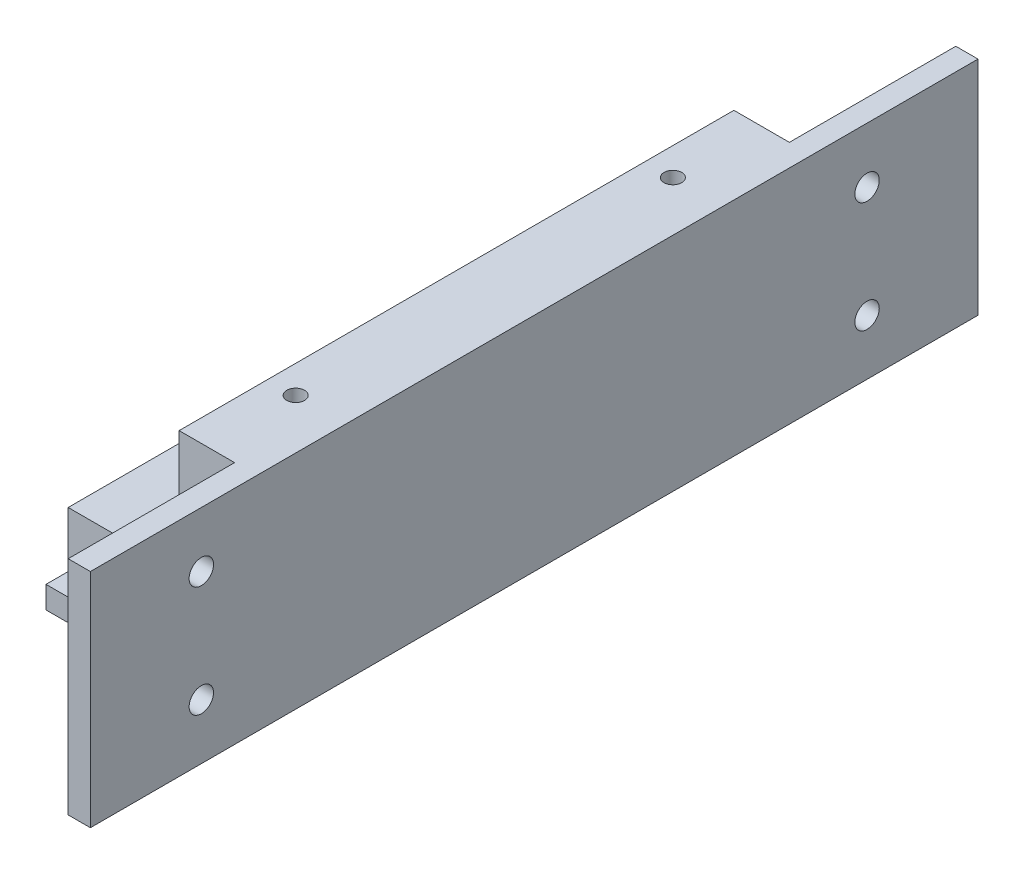
ISO-10303-21;
HEADER;
FILE_DESCRIPTION(('STEP AP214'),'2;1');
FILE_NAME('part.step','',(''),(''),'','','');
FILE_SCHEMA(('AUTOMOTIVE_DESIGN { 1 0 10303 214 1 1 1 1 }'));
ENDSEC;
DATA;
#1=APPLICATION_CONTEXT('core data for automotive mechanical design processes');
#2=APPLICATION_PROTOCOL_DEFINITION('international standard','automotive_design',2000,#1);
#3=PRODUCT_CONTEXT('',#1,'mechanical');
#4=PRODUCT('Part','Part','',(#3));
#5=PRODUCT_RELATED_PRODUCT_CATEGORY('part','',(#4));
#6=PRODUCT_DEFINITION_FORMATION('','',#4);
#7=PRODUCT_DEFINITION_CONTEXT('part definition',#1,'design');
#8=PRODUCT_DEFINITION('design','',#6,#7);
#9=PRODUCT_DEFINITION_SHAPE('','',#8);
#10=(LENGTH_UNIT() NAMED_UNIT(*) SI_UNIT(.MILLI.,.METRE.));
#11=(NAMED_UNIT(*) PLANE_ANGLE_UNIT() SI_UNIT($,.RADIAN.));
#12=(NAMED_UNIT(*) SI_UNIT($,.STERADIAN.) SOLID_ANGLE_UNIT());
#13=UNCERTAINTY_MEASURE_WITH_UNIT(LENGTH_MEASURE(1.E-05),#10,'distance_accuracy_value','');
#14=(GEOMETRIC_REPRESENTATION_CONTEXT(3) GLOBAL_UNCERTAINTY_ASSIGNED_CONTEXT((#13)) GLOBAL_UNIT_ASSIGNED_CONTEXT((#10,
#11,#12)) REPRESENTATION_CONTEXT('',''));
#15=CARTESIAN_POINT('',(0.,0.,0.));
#16=DIRECTION('',(0.,0.,1.));
#17=DIRECTION('',(1.,0.,0.));
#18=AXIS2_PLACEMENT_3D('',#15,#16,#17);
#19=CARTESIAN_POINT('',(-1.,2.,-25.));
#20=DIRECTION('',(0.,0.,1.));
#21=DIRECTION('',(1.,0.,0.));
#22=AXIS2_PLACEMENT_3D('',#19,#20,#21);
#23=PLANE('',#22);
#24=DIRECTION('',(-1.,0.,0.));
#25=VECTOR('',#24,1.);
#26=CARTESIAN_POINT('',(21.,20.,-25.));
#27=LINE('',#26,#25);
#28=CARTESIAN_POINT('',(16.,20.,-25.));
#29=VERTEX_POINT('',#28);
#30=CARTESIAN_POINT('',(11.,20.,-25.));
#31=VERTEX_POINT('',#30);
#32=EDGE_CURVE('E182',#29,#31,#27,.T.);
#33=ORIENTED_EDGE('',*,*,#32,.F.);
#34=DIRECTION('',(0.,-1.,0.));
#35=VECTOR('',#34,1.);
#36=CARTESIAN_POINT('',(16.,0.,-25.));
#37=LINE('',#36,#35);
#38=CARTESIAN_POINT('',(16.,0.,-25.));
#39=VERTEX_POINT('',#38);
#40=EDGE_CURVE('E215',#29,#39,#37,.T.);
#41=ORIENTED_EDGE('',*,*,#40,.T.);
#42=DIRECTION('',(-1.,0.,0.));
#43=VECTOR('',#42,1.);
#44=CARTESIAN_POINT('',(-1.,0.,-25.));
#45=LINE('',#44,#43);
#46=CARTESIAN_POINT('',(-1.,0.,-25.));
#47=VERTEX_POINT('',#46);
#48=EDGE_CURVE('E184',#39,#47,#45,.T.);
#49=ORIENTED_EDGE('',*,*,#48,.T.);
#50=DIRECTION('',(0.,-1.,0.));
#51=VECTOR('',#50,1.);
#52=CARTESIAN_POINT('',(-1.,2.,-25.));
#53=LINE('',#52,#51);
#54=CARTESIAN_POINT('',(-1.,2.,-25.));
#55=VERTEX_POINT('',#54);
#56=EDGE_CURVE('E11',#55,#47,#53,.T.);
#57=ORIENTED_EDGE('',*,*,#56,.F.);
#58=DIRECTION('',(-1.,0.,0.));
#59=VECTOR('',#58,1.);
#60=CARTESIAN_POINT('',(-1.,2.,-25.));
#61=LINE('',#60,#59);
#62=CARTESIAN_POINT('',(1.,2.,-25.));
#63=VERTEX_POINT('',#62);
#64=EDGE_CURVE('E188',#63,#55,#61,.T.);
#65=ORIENTED_EDGE('',*,*,#64,.F.);
#66=DIRECTION('',(0.,1.,0.));
#67=VECTOR('',#66,1.);
#68=CARTESIAN_POINT('',(1.,0.,-25.));
#69=LINE('',#68,#67);
#70=CARTESIAN_POINT('',(1.,9.,-25.));
#71=VERTEX_POINT('',#70);
#72=EDGE_CURVE('E177',#63,#71,#69,.T.);
#73=ORIENTED_EDGE('',*,*,#72,.T.);
#74=DIRECTION('',(1.,0.,0.));
#75=VECTOR('',#74,1.);
#76=CARTESIAN_POINT('',(1.,9.,-25.));
#77=LINE('',#76,#75);
#78=CARTESIAN_POINT('',(11.,9.,-25.));
#79=VERTEX_POINT('',#78);
#80=EDGE_CURVE('E157',#71,#79,#77,.T.);
#81=ORIENTED_EDGE('',*,*,#80,.T.);
#82=DIRECTION('',(0.,1.,0.));
#83=VECTOR('',#82,1.);
#84=CARTESIAN_POINT('',(11.,20.,-25.));
#85=LINE('',#84,#83);
#86=EDGE_CURVE('E160',#79,#31,#85,.T.);
#87=ORIENTED_EDGE('',*,*,#86,.T.);
#88=EDGE_LOOP('',(#33,#41,#49,#57,#65,#73,#81,#87));
#89=FACE_BOUND('',#88,.T.);
#90=ADVANCED_FACE('F39',(#89),#23,.F.);
#91=CARTESIAN_POINT('',(-1.,2.,25.));
#92=DIRECTION('',(1.,0.,0.));
#93=DIRECTION('',(0.,0.,-1.));
#94=AXIS2_PLACEMENT_3D('',#91,#92,#93);
#95=PLANE('',#94);
#96=DIRECTION('',(0.,0.,1.));
#97=VECTOR('',#96,1.);
#98=CARTESIAN_POINT('',(-1.,0.,25.));
#99=LINE('',#98,#97);
#100=CARTESIAN_POINT('',(-1.,0.,25.));
#101=VERTEX_POINT('',#100);
#102=EDGE_CURVE('E197',#47,#101,#99,.T.);
#103=ORIENTED_EDGE('',*,*,#102,.T.);
#104=DIRECTION('',(0.,-1.,0.));
#105=VECTOR('',#104,1.);
#106=CARTESIAN_POINT('',(-1.,2.,25.));
#107=LINE('',#106,#105);
#108=CARTESIAN_POINT('',(-1.,2.,25.));
#109=VERTEX_POINT('',#108);
#110=EDGE_CURVE('E46',#109,#101,#107,.T.);
#111=ORIENTED_EDGE('',*,*,#110,.F.);
#112=DIRECTION('',(0.,0.,1.));
#113=VECTOR('',#112,1.);
#114=CARTESIAN_POINT('',(-1.,2.,25.));
#115=LINE('',#114,#113);
#116=EDGE_CURVE('E191',#55,#109,#115,.T.);
#117=ORIENTED_EDGE('',*,*,#116,.F.);
#118=ORIENTED_EDGE('',*,*,#56,.T.);
#119=EDGE_LOOP('',(#103,#111,#117,#118));
#120=FACE_BOUND('',#119,.T.);
#121=ADVANCED_FACE('F304',(#120),#95,.F.);
#122=CARTESIAN_POINT('',(-1.,2.,25.));
#123=DIRECTION('',(0.,0.,-1.));
#124=DIRECTION('',(-1.,0.,0.));
#125=AXIS2_PLACEMENT_3D('',#122,#123,#124);
#126=PLANE('',#125);
#127=DIRECTION('',(1.,0.,0.));
#128=VECTOR('',#127,1.);
#129=CARTESIAN_POINT('',(-1.,0.,25.));
#130=LINE('',#129,#128);
#131=CARTESIAN_POINT('',(16.,0.,25.));
#132=VERTEX_POINT('',#131);
#133=EDGE_CURVE('E189',#101,#132,#130,.T.);
#134=ORIENTED_EDGE('',*,*,#133,.T.);
#135=DIRECTION('',(0.,1.,0.));
#136=VECTOR('',#135,1.);
#137=CARTESIAN_POINT('',(16.,20.,25.));
#138=LINE('',#137,#136);
#139=CARTESIAN_POINT('',(16.,20.,25.));
#140=VERTEX_POINT('',#139);
#141=EDGE_CURVE('E154',#132,#140,#138,.T.);
#142=ORIENTED_EDGE('',*,*,#141,.T.);
#143=DIRECTION('',(-1.,0.,0.));
#144=VECTOR('',#143,1.);
#145=CARTESIAN_POINT('',(21.,20.,25.));
#146=LINE('',#145,#144);
#147=CARTESIAN_POINT('',(11.,20.,25.));
#148=VERTEX_POINT('',#147);
#149=EDGE_CURVE('E180',#140,#148,#146,.T.);
#150=ORIENTED_EDGE('',*,*,#149,.T.);
#151=DIRECTION('',(0.,1.,0.));
#152=VECTOR('',#151,1.);
#153=CARTESIAN_POINT('',(11.,20.,25.));
#154=LINE('',#153,#152);
#155=CARTESIAN_POINT('',(11.,9.,25.));
#156=VERTEX_POINT('',#155);
#157=EDGE_CURVE('E161',#156,#148,#154,.T.);
#158=ORIENTED_EDGE('',*,*,#157,.F.);
#159=DIRECTION('',(1.,0.,0.));
#160=VECTOR('',#159,1.);
#161=CARTESIAN_POINT('',(1.,9.,25.));
#162=LINE('',#161,#160);
#163=CARTESIAN_POINT('',(1.,9.,25.));
#164=VERTEX_POINT('',#163);
#165=EDGE_CURVE('E151',#164,#156,#162,.T.);
#166=ORIENTED_EDGE('',*,*,#165,.F.);
#167=DIRECTION('',(0.,-1.,0.));
#168=VECTOR('',#167,1.);
#169=CARTESIAN_POINT('',(1.,0.,25.));
#170=LINE('',#169,#168);
#171=CARTESIAN_POINT('',(1.,2.,25.));
#172=VERTEX_POINT('',#171);
#173=EDGE_CURVE('E172',#164,#172,#170,.T.);
#174=ORIENTED_EDGE('',*,*,#173,.T.);
#175=DIRECTION('',(1.,0.,0.));
#176=VECTOR('',#175,1.);
#177=CARTESIAN_POINT('',(-1.,2.,25.));
#178=LINE('',#177,#176);
#179=EDGE_CURVE('E193',#109,#172,#178,.T.);
#180=ORIENTED_EDGE('',*,*,#179,.F.);
#181=ORIENTED_EDGE('',*,*,#110,.T.);
#182=EDGE_LOOP('',(#134,#142,#150,#158,#166,#174,#180,#181));
#183=FACE_BOUND('',#182,.T.);
#184=ADVANCED_FACE('F205',(#183),#126,.F.);
#185=CARTESIAN_POINT('',(0.,2.,0.));
#186=DIRECTION('',(0.,-1.,0.));
#187=DIRECTION('',(0.,0.,-1.));
#188=AXIS2_PLACEMENT_3D('',#185,#186,#187);
#189=PLANE('',#188);
#190=DIRECTION('',(0.,0.,-1.));
#191=VECTOR('',#190,1.);
#192=CARTESIAN_POINT('',(1.,2.,25.));
#193=LINE('',#192,#191);
#194=EDGE_CURVE('E185',#172,#63,#193,.T.);
#195=ORIENTED_EDGE('',*,*,#194,.T.);
#196=ORIENTED_EDGE('',*,*,#64,.T.);
#197=ORIENTED_EDGE('',*,*,#116,.T.);
#198=ORIENTED_EDGE('',*,*,#179,.T.);
#199=EDGE_LOOP('',(#195,#196,#197,#198));
#200=FACE_BOUND('',#199,.T.);
#201=ADVANCED_FACE('F302',(#200),#189,.F.);
#202=CARTESIAN_POINT('',(0.,0.,0.));
#203=DIRECTION('',(0.,-1.,0.));
#204=DIRECTION('',(0.,0.,-1.));
#205=AXIS2_PLACEMENT_3D('',#202,#203,#204);
#206=PLANE('',#205);
#207=DIRECTION('',(0.,0.,1.));
#208=VECTOR('',#207,1.);
#209=CARTESIAN_POINT('',(18.,0.,40.));
#210=LINE('',#209,#208);
#211=CARTESIAN_POINT('',(18.,0.,-40.));
#212=VERTEX_POINT('',#211);
#213=CARTESIAN_POINT('',(18.,0.,40.));
#214=VERTEX_POINT('',#213);
#215=EDGE_CURVE('E53',#212,#214,#210,.T.);
#216=ORIENTED_EDGE('',*,*,#215,.T.);
#217=DIRECTION('',(1.,0.,0.));
#218=VECTOR('',#217,1.);
#219=CARTESIAN_POINT('',(16.,0.,40.));
#220=LINE('',#219,#218);
#221=CARTESIAN_POINT('',(16.,0.,40.));
#222=VERTEX_POINT('',#221);
#223=EDGE_CURVE('E140',#222,#214,#220,.T.);
#224=ORIENTED_EDGE('',*,*,#223,.F.);
#225=DIRECTION('',(0.,0.,-1.));
#226=VECTOR('',#225,1.);
#227=CARTESIAN_POINT('',(16.,0.,40.));
#228=LINE('',#227,#226);
#229=EDGE_CURVE('E211',#222,#132,#228,.T.);
#230=ORIENTED_EDGE('',*,*,#229,.T.);
#231=ORIENTED_EDGE('',*,*,#133,.F.);
#232=ORIENTED_EDGE('',*,*,#102,.F.);
#233=ORIENTED_EDGE('',*,*,#48,.F.);
#234=DIRECTION('',(0.,0.,-1.));
#235=VECTOR('',#234,1.);
#236=CARTESIAN_POINT('',(16.,0.,-25.));
#237=LINE('',#236,#235);
#238=CARTESIAN_POINT('',(16.,0.,-40.));
#239=VERTEX_POINT('',#238);
#240=EDGE_CURVE('E61',#39,#239,#237,.T.);
#241=ORIENTED_EDGE('',*,*,#240,.T.);
#242=DIRECTION('',(1.,0.,0.));
#243=VECTOR('',#242,1.);
#244=CARTESIAN_POINT('',(16.,0.,-40.));
#245=LINE('',#244,#243);
#246=EDGE_CURVE('E142',#239,#212,#245,.T.);
#247=ORIENTED_EDGE('',*,*,#246,.T.);
#248=EDGE_LOOP('',(#216,#224,#230,#231,#232,#233,#241,#247));
#249=FACE_BOUND('',#248,.T.);
#250=ADVANCED_FACE('F138',(#249),#206,.T.);
#251=CARTESIAN_POINT('',(1.,0.,0.));
#252=DIRECTION('',(-1.,0.,0.));
#253=DIRECTION('',(0.,0.,1.));
#254=AXIS2_PLACEMENT_3D('',#251,#252,#253);
#255=PLANE('',#254);
#256=DIRECTION('',(0.,0.,1.));
#257=VECTOR('',#256,1.);
#258=CARTESIAN_POINT('',(1.,9.,-25.));
#259=LINE('',#258,#257);
#260=EDGE_CURVE('E164',#71,#164,#259,.T.);
#261=ORIENTED_EDGE('',*,*,#260,.F.);
#262=ORIENTED_EDGE('',*,*,#72,.F.);
#263=ORIENTED_EDGE('',*,*,#194,.F.);
#264=ORIENTED_EDGE('',*,*,#173,.F.);
#265=EDGE_LOOP('',(#261,#262,#263,#264));
#266=FACE_BOUND('',#265,.T.);
#267=ADVANCED_FACE('F281',(#266),#255,.T.);
#268=CARTESIAN_POINT('',(21.,20.,25.));
#269=DIRECTION('',(0.,-1.,0.));
#270=DIRECTION('',(0.,0.,-1.));
#271=AXIS2_PLACEMENT_3D('',#268,#269,#270);
#272=PLANE('',#271);
#273=CARTESIAN_POINT('',(13.5,20.,-17.));
#274=DIRECTION('',(0.,1.,0.));
#275=DIRECTION('',(0.,0.,1.));
#276=AXIS2_PLACEMENT_3D('',#273,#274,#275);
#277=CIRCLE('',#276,0.799999999999999);
#278=CARTESIAN_POINT('',(13.5,20.,-16.2));
#279=VERTEX_POINT('',#278);
#280=EDGE_CURVE('E262',#279,#279,#277,.T.);
#281=ORIENTED_EDGE('',*,*,#280,.F.);
#282=EDGE_LOOP('',(#281));
#283=FACE_BOUND('',#282,.T.);
#284=CARTESIAN_POINT('',(13.5,20.,17.));
#285=DIRECTION('',(0.,1.,0.));
#286=DIRECTION('',(0.,0.,1.));
#287=AXIS2_PLACEMENT_3D('',#284,#285,#286);
#288=CIRCLE('',#287,0.8);
#289=CARTESIAN_POINT('',(13.5,20.,17.8));
#290=VERTEX_POINT('',#289);
#291=EDGE_CURVE('E259',#290,#290,#288,.T.);
#292=ORIENTED_EDGE('',*,*,#291,.F.);
#293=EDGE_LOOP('',(#292));
#294=FACE_BOUND('',#293,.T.);
#295=DIRECTION('',(1.,0.,0.));
#296=VECTOR('',#295,1.);
#297=CARTESIAN_POINT('',(16.,20.,40.));
#298=LINE('',#297,#296);
#299=CARTESIAN_POINT('',(16.,20.,40.));
#300=VERTEX_POINT('',#299);
#301=CARTESIAN_POINT('',(18.,20.,40.));
#302=VERTEX_POINT('',#301);
#303=EDGE_CURVE('E148',#300,#302,#298,.T.);
#304=ORIENTED_EDGE('',*,*,#303,.T.);
#305=DIRECTION('',(0.,0.,1.));
#306=VECTOR('',#305,1.);
#307=CARTESIAN_POINT('',(18.,20.,40.));
#308=LINE('',#307,#306);
#309=CARTESIAN_POINT('',(18.,20.,-40.));
#310=VERTEX_POINT('',#309);
#311=EDGE_CURVE('E129',#310,#302,#308,.T.);
#312=ORIENTED_EDGE('',*,*,#311,.F.);
#313=DIRECTION('',(1.,0.,0.));
#314=VECTOR('',#313,1.);
#315=CARTESIAN_POINT('',(16.,20.,-40.));
#316=LINE('',#315,#314);
#317=CARTESIAN_POINT('',(16.,20.,-40.));
#318=VERTEX_POINT('',#317);
#319=EDGE_CURVE('E133',#318,#310,#316,.T.);
#320=ORIENTED_EDGE('',*,*,#319,.F.);
#321=DIRECTION('',(0.,0.,1.));
#322=VECTOR('',#321,1.);
#323=CARTESIAN_POINT('',(16.,20.,-25.));
#324=LINE('',#323,#322);
#325=EDGE_CURVE('E223',#318,#29,#324,.T.);
#326=ORIENTED_EDGE('',*,*,#325,.T.);
#327=ORIENTED_EDGE('',*,*,#32,.T.);
#328=DIRECTION('',(0.,0.,1.));
#329=VECTOR('',#328,1.);
#330=CARTESIAN_POINT('',(11.,20.,-25.));
#331=LINE('',#330,#329);
#332=EDGE_CURVE('E169',#31,#148,#331,.T.);
#333=ORIENTED_EDGE('',*,*,#332,.T.);
#334=ORIENTED_EDGE('',*,*,#149,.F.);
#335=DIRECTION('',(0.,0.,1.));
#336=VECTOR('',#335,1.);
#337=CARTESIAN_POINT('',(16.,20.,40.));
#338=LINE('',#337,#336);
#339=EDGE_CURVE('E149',#140,#300,#338,.T.);
#340=ORIENTED_EDGE('',*,*,#339,.T.);
#341=EDGE_LOOP('',(#304,#312,#320,#326,#327,#333,#334,#340));
#342=FACE_BOUND('',#341,.T.);
#343=ADVANCED_FACE('F277',(#283,#294,#342),#272,.F.);
#344=CARTESIAN_POINT('',(11.,20.,-25.));
#345=DIRECTION('',(1.,0.,0.));
#346=DIRECTION('',(0.,1.,0.));
#347=AXIS2_PLACEMENT_3D('',#344,#345,#346);
#348=PLANE('',#347);
#349=ORIENTED_EDGE('',*,*,#157,.T.);
#350=ORIENTED_EDGE('',*,*,#332,.F.);
#351=ORIENTED_EDGE('',*,*,#86,.F.);
#352=DIRECTION('',(0.,0.,1.));
#353=VECTOR('',#352,1.);
#354=CARTESIAN_POINT('',(11.,9.,-25.));
#355=LINE('',#354,#353);
#356=EDGE_CURVE('E173',#79,#156,#355,.T.);
#357=ORIENTED_EDGE('',*,*,#356,.T.);
#358=EDGE_LOOP('',(#349,#350,#351,#357));
#359=FACE_BOUND('',#358,.T.);
#360=ADVANCED_FACE('F280',(#359),#348,.F.);
#361=CARTESIAN_POINT('',(1.,9.,-25.));
#362=DIRECTION('',(0.,-1.,0.));
#363=DIRECTION('',(0.,0.,-1.));
#364=AXIS2_PLACEMENT_3D('',#361,#362,#363);
#365=PLANE('',#364);
#366=ORIENTED_EDGE('',*,*,#165,.T.);
#367=ORIENTED_EDGE('',*,*,#356,.F.);
#368=ORIENTED_EDGE('',*,*,#80,.F.);
#369=ORIENTED_EDGE('',*,*,#260,.T.);
#370=EDGE_LOOP('',(#366,#367,#368,#369));
#371=FACE_BOUND('',#370,.T.);
#372=ADVANCED_FACE('F296',(#371),#365,.F.);
#373=CARTESIAN_POINT('',(16.,20.,40.));
#374=DIRECTION('',(0.,0.,1.));
#375=DIRECTION('',(1.,0.,0.));
#376=AXIS2_PLACEMENT_3D('',#373,#374,#375);
#377=PLANE('',#376);
#378=DIRECTION('',(0.,1.,0.));
#379=VECTOR('',#378,1.);
#380=CARTESIAN_POINT('',(18.,0.,40.));
#381=LINE('',#380,#379);
#382=EDGE_CURVE('E126',#214,#302,#381,.T.);
#383=ORIENTED_EDGE('',*,*,#382,.T.);
#384=ORIENTED_EDGE('',*,*,#303,.F.);
#385=DIRECTION('',(0.,-1.,0.));
#386=VECTOR('',#385,1.);
#387=CARTESIAN_POINT('',(16.,20.,40.));
#388=LINE('',#387,#386);
#389=EDGE_CURVE('E147',#300,#222,#388,.T.);
#390=ORIENTED_EDGE('',*,*,#389,.T.);
#391=ORIENTED_EDGE('',*,*,#223,.T.);
#392=EDGE_LOOP('',(#383,#384,#390,#391));
#393=FACE_BOUND('',#392,.T.);
#394=ADVANCED_FACE('F145',(#393),#377,.T.);
#395=CARTESIAN_POINT('',(16.,0.,0.));
#396=DIRECTION('',(1.,0.,0.));
#397=DIRECTION('',(0.,0.,-1.));
#398=AXIS2_PLACEMENT_3D('',#395,#396,#397);
#399=PLANE('',#398);
#400=CARTESIAN_POINT('',(16.,15.,30.));
#401=DIRECTION('',(1.,0.,0.));
#402=DIRECTION('',(0.,0.,-1.));
#403=AXIS2_PLACEMENT_3D('',#400,#401,#402);
#404=CIRCLE('',#403,1.1);
#405=CARTESIAN_POINT('',(16.,15.,28.9));
#406=VERTEX_POINT('',#405);
#407=EDGE_CURVE('E234',#406,#406,#404,.T.);
#408=ORIENTED_EDGE('',*,*,#407,.T.);
#409=EDGE_LOOP('',(#408));
#410=FACE_BOUND('',#409,.T.);
#411=CARTESIAN_POINT('',(16.,5.,30.));
#412=DIRECTION('',(1.,0.,0.));
#413=DIRECTION('',(0.,0.,-1.));
#414=AXIS2_PLACEMENT_3D('',#411,#412,#413);
#415=CIRCLE('',#414,1.1);
#416=CARTESIAN_POINT('',(16.,5.,28.9));
#417=VERTEX_POINT('',#416);
#418=EDGE_CURVE('E237',#417,#417,#415,.T.);
#419=ORIENTED_EDGE('',*,*,#418,.T.);
#420=EDGE_LOOP('',(#419));
#421=FACE_BOUND('',#420,.T.);
#422=ORIENTED_EDGE('',*,*,#389,.F.);
#423=ORIENTED_EDGE('',*,*,#339,.F.);
#424=ORIENTED_EDGE('',*,*,#141,.F.);
#425=ORIENTED_EDGE('',*,*,#229,.F.);
#426=EDGE_LOOP('',(#422,#423,#424,#425));
#427=FACE_BOUND('',#426,.T.);
#428=ADVANCED_FACE('F286',(#410,#421,#427),#399,.F.);
#429=CARTESIAN_POINT('',(16.,0.,-40.));
#430=DIRECTION('',(0.,0.,-1.));
#431=DIRECTION('',(-1.,0.,0.));
#432=AXIS2_PLACEMENT_3D('',#429,#430,#431);
#433=PLANE('',#432);
#434=DIRECTION('',(0.,1.,0.));
#435=VECTOR('',#434,1.);
#436=CARTESIAN_POINT('',(18.,0.,-40.));
#437=LINE('',#436,#435);
#438=EDGE_CURVE('E134',#212,#310,#437,.T.);
#439=ORIENTED_EDGE('',*,*,#438,.F.);
#440=ORIENTED_EDGE('',*,*,#246,.F.);
#441=DIRECTION('',(0.,1.,0.));
#442=VECTOR('',#441,1.);
#443=CARTESIAN_POINT('',(16.,0.,-40.));
#444=LINE('',#443,#442);
#445=EDGE_CURVE('E220',#239,#318,#444,.T.);
#446=ORIENTED_EDGE('',*,*,#445,.T.);
#447=ORIENTED_EDGE('',*,*,#319,.T.);
#448=EDGE_LOOP('',(#439,#440,#446,#447));
#449=FACE_BOUND('',#448,.T.);
#450=ADVANCED_FACE('F308',(#449),#433,.T.);
#451=CARTESIAN_POINT('',(16.,0.,0.));
#452=DIRECTION('',(-1.,0.,0.));
#453=DIRECTION('',(0.,0.,1.));
#454=AXIS2_PLACEMENT_3D('',#451,#452,#453);
#455=PLANE('',#454);
#456=CARTESIAN_POINT('',(16.,5.,-30.));
#457=DIRECTION('',(-1.,0.,0.));
#458=DIRECTION('',(0.,0.,1.));
#459=AXIS2_PLACEMENT_3D('',#456,#457,#458);
#460=CIRCLE('',#459,1.1);
#461=CARTESIAN_POINT('',(16.,5.,-28.9));
#462=VERTEX_POINT('',#461);
#463=EDGE_CURVE('E230',#462,#462,#460,.T.);
#464=ORIENTED_EDGE('',*,*,#463,.F.);
#465=EDGE_LOOP('',(#464));
#466=FACE_BOUND('',#465,.T.);
#467=CARTESIAN_POINT('',(16.,15.,-30.));
#468=DIRECTION('',(-1.,0.,0.));
#469=DIRECTION('',(0.,0.,1.));
#470=AXIS2_PLACEMENT_3D('',#467,#468,#469);
#471=CIRCLE('',#470,1.1);
#472=CARTESIAN_POINT('',(16.,15.,-28.9));
#473=VERTEX_POINT('',#472);
#474=EDGE_CURVE('E240',#473,#473,#471,.T.);
#475=ORIENTED_EDGE('',*,*,#474,.F.);
#476=EDGE_LOOP('',(#475));
#477=FACE_BOUND('',#476,.T.);
#478=ORIENTED_EDGE('',*,*,#40,.F.);
#479=ORIENTED_EDGE('',*,*,#325,.F.);
#480=ORIENTED_EDGE('',*,*,#445,.F.);
#481=ORIENTED_EDGE('',*,*,#240,.F.);
#482=EDGE_LOOP('',(#478,#479,#480,#481));
#483=FACE_BOUND('',#482,.T.);
#484=ADVANCED_FACE('F306',(#466,#477,#483),#455,.T.);
#485=CARTESIAN_POINT('',(18.,0.,40.));
#486=DIRECTION('',(-1.,0.,0.));
#487=DIRECTION('',(0.,0.,1.));
#488=AXIS2_PLACEMENT_3D('',#485,#486,#487);
#489=PLANE('',#488);
#490=CARTESIAN_POINT('',(18.,5.,-30.));
#491=DIRECTION('',(1.,0.,0.));
#492=DIRECTION('',(0.,0.,-1.));
#493=AXIS2_PLACEMENT_3D('',#490,#491,#492);
#494=CIRCLE('',#493,1.1);
#495=CARTESIAN_POINT('',(18.,5.,-31.1));
#496=VERTEX_POINT('',#495);
#497=EDGE_CURVE('E246',#496,#496,#494,.T.);
#498=ORIENTED_EDGE('',*,*,#497,.F.);
#499=EDGE_LOOP('',(#498));
#500=FACE_BOUND('',#499,.T.);
#501=CARTESIAN_POINT('',(18.,15.,30.));
#502=DIRECTION('',(1.,0.,0.));
#503=DIRECTION('',(0.,0.,-1.));
#504=AXIS2_PLACEMENT_3D('',#501,#502,#503);
#505=CIRCLE('',#504,1.1);
#506=CARTESIAN_POINT('',(18.,15.,28.9));
#507=VERTEX_POINT('',#506);
#508=EDGE_CURVE('E247',#507,#507,#505,.T.);
#509=ORIENTED_EDGE('',*,*,#508,.F.);
#510=EDGE_LOOP('',(#509));
#511=FACE_BOUND('',#510,.T.);
#512=CARTESIAN_POINT('',(18.,5.,30.));
#513=DIRECTION('',(1.,0.,0.));
#514=DIRECTION('',(0.,0.,-1.));
#515=AXIS2_PLACEMENT_3D('',#512,#513,#514);
#516=CIRCLE('',#515,1.1);
#517=CARTESIAN_POINT('',(18.,5.,28.9));
#518=VERTEX_POINT('',#517);
#519=EDGE_CURVE('E250',#518,#518,#516,.T.);
#520=ORIENTED_EDGE('',*,*,#519,.F.);
#521=EDGE_LOOP('',(#520));
#522=FACE_BOUND('',#521,.T.);
#523=CARTESIAN_POINT('',(18.,15.,-30.));
#524=DIRECTION('',(1.,0.,0.));
#525=DIRECTION('',(0.,0.,-1.));
#526=AXIS2_PLACEMENT_3D('',#523,#524,#525);
#527=CIRCLE('',#526,1.1);
#528=CARTESIAN_POINT('',(18.,15.,-31.1));
#529=VERTEX_POINT('',#528);
#530=EDGE_CURVE('E243',#529,#529,#527,.T.);
#531=ORIENTED_EDGE('',*,*,#530,.F.);
#532=EDGE_LOOP('',(#531));
#533=FACE_BOUND('',#532,.T.);
#534=ORIENTED_EDGE('',*,*,#311,.T.);
#535=ORIENTED_EDGE('',*,*,#382,.F.);
#536=ORIENTED_EDGE('',*,*,#215,.F.);
#537=ORIENTED_EDGE('',*,*,#438,.T.);
#538=EDGE_LOOP('',(#534,#535,#536,#537));
#539=FACE_BOUND('',#538,.T.);
#540=ADVANCED_FACE('F127',(#500,#511,#522,#533,#539),#489,.F.);
#541=CARTESIAN_POINT('',(-1.,15.,-30.));
#542=DIRECTION('',(1.,0.,0.));
#543=DIRECTION('',(0.,0.,-1.));
#544=AXIS2_PLACEMENT_3D('',#541,#542,#543);
#545=CYLINDRICAL_SURFACE('',#544,1.1);
#546=ORIENTED_EDGE('',*,*,#474,.T.);
#547=EDGE_LOOP('',(#546));
#548=FACE_BOUND('',#547,.T.);
#549=ORIENTED_EDGE('',*,*,#530,.T.);
#550=EDGE_LOOP('',(#549));
#551=FACE_BOUND('',#550,.T.);
#552=ADVANCED_FACE('F367',(#548,#551),#545,.F.);
#553=CARTESIAN_POINT('',(-1.,5.,30.));
#554=DIRECTION('',(1.,0.,0.));
#555=DIRECTION('',(0.,0.,-1.));
#556=AXIS2_PLACEMENT_3D('',#553,#554,#555);
#557=CYLINDRICAL_SURFACE('',#556,1.1);
#558=ORIENTED_EDGE('',*,*,#519,.T.);
#559=EDGE_LOOP('',(#558));
#560=FACE_BOUND('',#559,.T.);
#561=ORIENTED_EDGE('',*,*,#418,.F.);
#562=EDGE_LOOP('',(#561));
#563=FACE_BOUND('',#562,.T.);
#564=ADVANCED_FACE('F375',(#560,#563),#557,.F.);
#565=CARTESIAN_POINT('',(-1.,15.,30.));
#566=DIRECTION('',(1.,0.,0.));
#567=DIRECTION('',(0.,0.,-1.));
#568=AXIS2_PLACEMENT_3D('',#565,#566,#567);
#569=CYLINDRICAL_SURFACE('',#568,1.1);
#570=ORIENTED_EDGE('',*,*,#508,.T.);
#571=EDGE_LOOP('',(#570));
#572=FACE_BOUND('',#571,.T.);
#573=ORIENTED_EDGE('',*,*,#407,.F.);
#574=EDGE_LOOP('',(#573));
#575=FACE_BOUND('',#574,.T.);
#576=ADVANCED_FACE('F386',(#572,#575),#569,.F.);
#577=CARTESIAN_POINT('',(-1.,5.,-30.));
#578=DIRECTION('',(1.,0.,0.));
#579=DIRECTION('',(0.,0.,-1.));
#580=AXIS2_PLACEMENT_3D('',#577,#578,#579);
#581=CYLINDRICAL_SURFACE('',#580,1.1);
#582=ORIENTED_EDGE('',*,*,#463,.T.);
#583=EDGE_LOOP('',(#582));
#584=FACE_BOUND('',#583,.T.);
#585=ORIENTED_EDGE('',*,*,#497,.T.);
#586=EDGE_LOOP('',(#585));
#587=FACE_BOUND('',#586,.T.);
#588=ADVANCED_FACE('F397',(#584,#587),#581,.F.);
#589=CARTESIAN_POINT('',(13.5,18.,17.));
#590=DIRECTION('',(0.,1.,0.));
#591=DIRECTION('',(0.,0.,1.));
#592=AXIS2_PLACEMENT_3D('',#589,#590,#591);
#593=CYLINDRICAL_SURFACE('',#592,0.8);
#594=CARTESIAN_POINT('',(13.5,18.,17.));
#595=DIRECTION('',(0.,1.,0.));
#596=DIRECTION('',(0.,0.,1.));
#597=AXIS2_PLACEMENT_3D('',#594,#595,#596);
#598=CIRCLE('',#597,0.8);
#599=CARTESIAN_POINT('',(13.5,18.,17.8));
#600=VERTEX_POINT('',#599);
#601=EDGE_CURVE('E256',#600,#600,#598,.T.);
#602=ORIENTED_EDGE('',*,*,#601,.F.);
#603=EDGE_LOOP('',(#602));
#604=FACE_BOUND('',#603,.T.);
#605=ORIENTED_EDGE('',*,*,#291,.T.);
#606=EDGE_LOOP('',(#605));
#607=FACE_BOUND('',#606,.T.);
#608=ADVANCED_FACE('F407',(#604,#607),#593,.F.);
#609=CARTESIAN_POINT('',(13.5,18.,17.));
#610=DIRECTION('',(0.,1.,0.));
#611=DIRECTION('',(0.,0.,1.));
#612=AXIS2_PLACEMENT_3D('',#609,#610,#611);
#613=PLANE('',#612);
#614=ORIENTED_EDGE('',*,*,#601,.T.);
#615=EDGE_LOOP('',(#614));
#616=FACE_BOUND('',#615,.T.);
#617=ADVANCED_FACE('F273',(#616),#613,.T.);
#618=CARTESIAN_POINT('',(13.5,18.,-17.));
#619=DIRECTION('',(0.,1.,0.));
#620=DIRECTION('',(0.,0.,1.));
#621=AXIS2_PLACEMENT_3D('',#618,#619,#620);
#622=CYLINDRICAL_SURFACE('',#621,0.799999999999999);
#623=CARTESIAN_POINT('',(13.5,18.,-17.));
#624=DIRECTION('',(0.,1.,0.));
#625=DIRECTION('',(0.,0.,1.));
#626=AXIS2_PLACEMENT_3D('',#623,#624,#625);
#627=CIRCLE('',#626,0.799999999999999);
#628=CARTESIAN_POINT('',(13.5,18.,-16.2));
#629=VERTEX_POINT('',#628);
#630=EDGE_CURVE('E255',#629,#629,#627,.T.);
#631=ORIENTED_EDGE('',*,*,#630,.F.);
#632=EDGE_LOOP('',(#631));
#633=FACE_BOUND('',#632,.T.);
#634=ORIENTED_EDGE('',*,*,#280,.T.);
#635=EDGE_LOOP('',(#634));
#636=FACE_BOUND('',#635,.T.);
#637=ADVANCED_FACE('F270',(#633,#636),#622,.F.);
#638=CARTESIAN_POINT('',(13.5,18.,-17.));
#639=DIRECTION('',(0.,1.,0.));
#640=DIRECTION('',(0.,0.,1.));
#641=AXIS2_PLACEMENT_3D('',#638,#639,#640);
#642=PLANE('',#641);
#643=ORIENTED_EDGE('',*,*,#630,.T.);
#644=EDGE_LOOP('',(#643));
#645=FACE_BOUND('',#644,.T.);
#646=ADVANCED_FACE('F268',(#645),#642,.T.);
#647=CLOSED_SHELL('',(#90,#121,#184,#201,#250,#267,#343,#360,#372,#394,#428,#450,#484,#540,#552,
#564,#576,#588,#608,#617,#637,#646));
#648=MANIFOLD_SOLID_BREP('B2',#647);
#649=ADVANCED_BREP_SHAPE_REPRESENTATION('',(#18,#648),#14);
#650=SHAPE_DEFINITION_REPRESENTATION(#9,#649);
ENDSEC;
END-ISO-10303-21;
